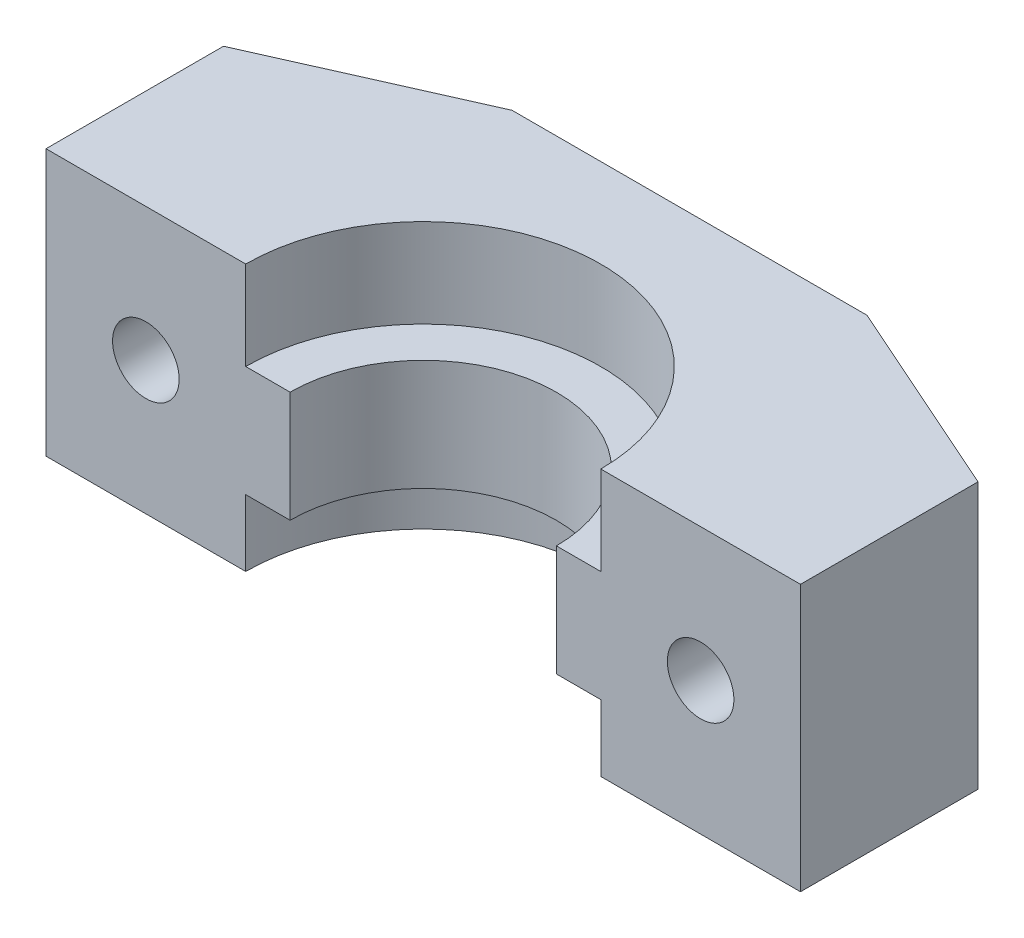
ISO-10303-21;
HEADER;
FILE_DESCRIPTION(('STEP AP214'),'2;1');
FILE_NAME('part.step','',(''),(''),'','','');
FILE_SCHEMA(('AUTOMOTIVE_DESIGN { 1 0 10303 214 1 1 1 1 }'));
ENDSEC;
DATA;
#1=APPLICATION_CONTEXT('core data for automotive mechanical design processes');
#2=APPLICATION_PROTOCOL_DEFINITION('international standard','automotive_design',2000,#1);
#3=PRODUCT_CONTEXT('',#1,'mechanical');
#4=PRODUCT('Part','Part','',(#3));
#5=PRODUCT_RELATED_PRODUCT_CATEGORY('part','',(#4));
#6=PRODUCT_DEFINITION_FORMATION('','',#4);
#7=PRODUCT_DEFINITION_CONTEXT('part definition',#1,'design');
#8=PRODUCT_DEFINITION('design','',#6,#7);
#9=PRODUCT_DEFINITION_SHAPE('','',#8);
#10=(LENGTH_UNIT() NAMED_UNIT(*) SI_UNIT(.MILLI.,.METRE.));
#11=(NAMED_UNIT(*) PLANE_ANGLE_UNIT() SI_UNIT($,.RADIAN.));
#12=(NAMED_UNIT(*) SI_UNIT($,.STERADIAN.) SOLID_ANGLE_UNIT());
#13=UNCERTAINTY_MEASURE_WITH_UNIT(LENGTH_MEASURE(1.E-05),#10,'distance_accuracy_value','');
#14=(GEOMETRIC_REPRESENTATION_CONTEXT(3) GLOBAL_UNCERTAINTY_ASSIGNED_CONTEXT((#13)) GLOBAL_UNIT_ASSIGNED_CONTEXT((#10,
#11,#12)) REPRESENTATION_CONTEXT('',''));
#15=CARTESIAN_POINT('',(0.,0.,0.));
#16=DIRECTION('',(0.,0.,1.));
#17=DIRECTION('',(1.,0.,0.));
#18=AXIS2_PLACEMENT_3D('',#15,#16,#17);
#19=CARTESIAN_POINT('',(0.,12.,0.));
#20=DIRECTION('',(0.,0.,-1.));
#21=DIRECTION('',(-1.,0.,0.));
#22=AXIS2_PLACEMENT_3D('',#19,#20,#21);
#23=PLANE('',#22);
#24=CARTESIAN_POINT('',(4.5,6.,0.));
#25=DIRECTION('',(0.,0.,1.));
#26=DIRECTION('',(1.,0.,0.));
#27=AXIS2_PLACEMENT_3D('',#24,#25,#26);
#28=CIRCLE('',#27,1.5);
#29=CARTESIAN_POINT('',(6.,6.,0.));
#30=VERTEX_POINT('',#29);
#31=EDGE_CURVE('E176',#30,#30,#28,.T.);
#32=ORIENTED_EDGE('',*,*,#31,.F.);
#33=EDGE_LOOP('',(#32));
#34=FACE_BOUND('',#33,.T.);
#35=DIRECTION('',(0.,1.,0.));
#36=VECTOR('',#35,1.);
#37=CARTESIAN_POINT('',(9.00000000000001,-57.5,0.));
#38=LINE('',#37,#36);
#39=CARTESIAN_POINT('',(9.00000000000001,0.,0.));
#40=VERTEX_POINT('',#39);
#41=CARTESIAN_POINT('',(9.00000000000001,3.,0.));
#42=VERTEX_POINT('',#41);
#43=EDGE_CURVE('E51',#40,#42,#38,.T.);
#44=ORIENTED_EDGE('',*,*,#43,.T.);
#45=DIRECTION('',(1.,0.,0.));
#46=VECTOR('',#45,1.);
#47=CARTESIAN_POINT('',(0.,3.,0.));
#48=LINE('',#47,#46);
#49=CARTESIAN_POINT('',(11.,3.,0.));
#50=VERTEX_POINT('',#49);
#51=EDGE_CURVE('E132',#42,#50,#48,.T.);
#52=ORIENTED_EDGE('',*,*,#51,.T.);
#53=DIRECTION('',(0.,-1.,0.));
#54=VECTOR('',#53,1.);
#55=CARTESIAN_POINT('',(11.,12.,0.));
#56=LINE('',#55,#54);
#57=CARTESIAN_POINT('',(11.,8.,0.));
#58=VERTEX_POINT('',#57);
#59=EDGE_CURVE('E11',#58,#50,#56,.T.);
#60=ORIENTED_EDGE('',*,*,#59,.F.);
#61=DIRECTION('',(1.,0.,0.));
#62=VECTOR('',#61,1.);
#63=CARTESIAN_POINT('',(0.,8.,0.));
#64=LINE('',#63,#62);
#65=CARTESIAN_POINT('',(9.00000000000001,7.99999999999999,0.));
#66=VERTEX_POINT('',#65);
#67=EDGE_CURVE('E161',#66,#58,#64,.T.);
#68=ORIENTED_EDGE('',*,*,#67,.F.);
#69=DIRECTION('',(0.,-1.,0.));
#70=VECTOR('',#69,1.);
#71=CARTESIAN_POINT('',(9.00000000000001,74.5,0.));
#72=LINE('',#71,#70);
#73=CARTESIAN_POINT('',(9.00000000000001,12.,0.));
#74=VERTEX_POINT('',#73);
#75=EDGE_CURVE('E157',#74,#66,#72,.T.);
#76=ORIENTED_EDGE('',*,*,#75,.F.);
#77=DIRECTION('',(1.,0.,0.));
#78=VECTOR('',#77,1.);
#79=CARTESIAN_POINT('',(0.,12.,0.));
#80=LINE('',#79,#78);
#81=CARTESIAN_POINT('',(0.,12.,0.));
#82=VERTEX_POINT('',#81);
#83=EDGE_CURVE('E181',#82,#74,#80,.T.);
#84=ORIENTED_EDGE('',*,*,#83,.F.);
#85=DIRECTION('',(0.,-1.,0.));
#86=VECTOR('',#85,1.);
#87=CARTESIAN_POINT('',(0.,12.,0.));
#88=LINE('',#87,#86);
#89=CARTESIAN_POINT('',(0.,0.,0.));
#90=VERTEX_POINT('',#89);
#91=EDGE_CURVE('E197',#82,#90,#88,.T.);
#92=ORIENTED_EDGE('',*,*,#91,.T.);
#93=DIRECTION('',(1.,0.,0.));
#94=VECTOR('',#93,1.);
#95=CARTESIAN_POINT('',(0.,0.,0.));
#96=LINE('',#95,#94);
#97=EDGE_CURVE('E180',#90,#40,#96,.T.);
#98=ORIENTED_EDGE('',*,*,#97,.T.);
#99=EDGE_LOOP('',(#44,#52,#60,#68,#76,#84,#92,#98));
#100=FACE_BOUND('',#99,.T.);
#101=ADVANCED_FACE('F35',(#34,#100),#23,.F.);
#102=CARTESIAN_POINT('',(17.,12.,0.));
#103=DIRECTION('',(0.,-1.,0.));
#104=DIRECTION('',(0.,0.,-1.));
#105=AXIS2_PLACEMENT_3D('',#102,#103,#104);
#106=CYLINDRICAL_SURFACE('',#105,6.);
#107=CARTESIAN_POINT('',(17.,3.,0.));
#108=DIRECTION('',(0.,-1.,0.));
#109=DIRECTION('',(0.,0.,-1.));
#110=AXIS2_PLACEMENT_3D('',#107,#108,#109);
#111=CIRCLE('',#110,6.);
#112=CARTESIAN_POINT('',(23.,3.,0.));
#113=VERTEX_POINT('',#112);
#114=EDGE_CURVE('E134',#50,#113,#111,.T.);
#115=ORIENTED_EDGE('',*,*,#114,.T.);
#116=DIRECTION('',(0.,-1.,0.));
#117=VECTOR('',#116,1.);
#118=CARTESIAN_POINT('',(23.,12.,0.));
#119=LINE('',#118,#117);
#120=CARTESIAN_POINT('',(23.,8.,0.));
#121=VERTEX_POINT('',#120);
#122=EDGE_CURVE('E43',#121,#113,#119,.T.);
#123=ORIENTED_EDGE('',*,*,#122,.F.);
#124=CARTESIAN_POINT('',(17.,8.,0.));
#125=DIRECTION('',(0.,-1.,0.));
#126=DIRECTION('',(0.,0.,-1.));
#127=AXIS2_PLACEMENT_3D('',#124,#125,#126);
#128=CIRCLE('',#127,6.);
#129=EDGE_CURVE('E163',#58,#121,#128,.T.);
#130=ORIENTED_EDGE('',*,*,#129,.F.);
#131=ORIENTED_EDGE('',*,*,#59,.T.);
#132=EDGE_LOOP('',(#115,#123,#130,#131));
#133=FACE_BOUND('',#132,.T.);
#134=ADVANCED_FACE('F258',(#133),#106,.F.);
#135=CARTESIAN_POINT('',(34.,12.,0.));
#136=DIRECTION('',(0.,0.,-1.));
#137=DIRECTION('',(-1.,0.,0.));
#138=AXIS2_PLACEMENT_3D('',#135,#136,#137);
#139=PLANE('',#138);
#140=CARTESIAN_POINT('',(29.5,6.,0.));
#141=DIRECTION('',(0.,0.,1.));
#142=DIRECTION('',(1.,0.,0.));
#143=AXIS2_PLACEMENT_3D('',#140,#141,#142);
#144=CIRCLE('',#143,1.5);
#145=CARTESIAN_POINT('',(31.,6.,0.));
#146=VERTEX_POINT('',#145);
#147=EDGE_CURVE('E173',#146,#146,#144,.T.);
#148=ORIENTED_EDGE('',*,*,#147,.F.);
#149=EDGE_LOOP('',(#148));
#150=FACE_BOUND('',#149,.T.);
#151=DIRECTION('',(0.,1.,0.));
#152=VECTOR('',#151,1.);
#153=CARTESIAN_POINT('',(25.,-57.5,0.));
#154=LINE('',#153,#152);
#155=CARTESIAN_POINT('',(25.,0.,0.));
#156=VERTEX_POINT('',#155);
#157=CARTESIAN_POINT('',(25.,3.,0.));
#158=VERTEX_POINT('',#157);
#159=EDGE_CURVE('E133',#156,#158,#154,.T.);
#160=ORIENTED_EDGE('',*,*,#159,.F.);
#161=DIRECTION('',(1.,0.,0.));
#162=VECTOR('',#161,1.);
#163=CARTESIAN_POINT('',(34.,0.,0.));
#164=LINE('',#163,#162);
#165=CARTESIAN_POINT('',(34.,0.,0.));
#166=VERTEX_POINT('',#165);
#167=EDGE_CURVE('E200',#156,#166,#164,.T.);
#168=ORIENTED_EDGE('',*,*,#167,.T.);
#169=DIRECTION('',(0.,-1.,0.));
#170=VECTOR('',#169,1.);
#171=CARTESIAN_POINT('',(34.,12.,0.));
#172=LINE('',#171,#170);
#173=CARTESIAN_POINT('',(34.,12.,0.));
#174=VERTEX_POINT('',#173);
#175=EDGE_CURVE('E225',#174,#166,#172,.T.);
#176=ORIENTED_EDGE('',*,*,#175,.F.);
#177=DIRECTION('',(1.,0.,0.));
#178=VECTOR('',#177,1.);
#179=CARTESIAN_POINT('',(34.,12.,0.));
#180=LINE('',#179,#178);
#181=CARTESIAN_POINT('',(25.,12.,0.));
#182=VERTEX_POINT('',#181);
#183=EDGE_CURVE('E184',#182,#174,#180,.T.);
#184=ORIENTED_EDGE('',*,*,#183,.F.);
#185=DIRECTION('',(0.,-1.,0.));
#186=VECTOR('',#185,1.);
#187=CARTESIAN_POINT('',(25.,74.5,0.));
#188=LINE('',#187,#186);
#189=CARTESIAN_POINT('',(25.,7.99999999999999,0.));
#190=VERTEX_POINT('',#189);
#191=EDGE_CURVE('E59',#182,#190,#188,.T.);
#192=ORIENTED_EDGE('',*,*,#191,.T.);
#193=DIRECTION('',(1.,0.,0.));
#194=VECTOR('',#193,1.);
#195=CARTESIAN_POINT('',(34.,8.,0.));
#196=LINE('',#195,#194);
#197=EDGE_CURVE('E155',#121,#190,#196,.T.);
#198=ORIENTED_EDGE('',*,*,#197,.F.);
#199=ORIENTED_EDGE('',*,*,#122,.T.);
#200=DIRECTION('',(1.,0.,0.));
#201=VECTOR('',#200,1.);
#202=CARTESIAN_POINT('',(34.,3.,0.));
#203=LINE('',#202,#201);
#204=EDGE_CURVE('E129',#113,#158,#203,.T.);
#205=ORIENTED_EDGE('',*,*,#204,.T.);
#206=EDGE_LOOP('',(#160,#168,#176,#184,#192,#198,#199,#205));
#207=FACE_BOUND('',#206,.T.);
#208=ADVANCED_FACE('F143',(#150,#207),#139,.F.);
#209=CARTESIAN_POINT('',(17.,0.,0.));
#210=DIRECTION('',(0.,-1.,0.));
#211=DIRECTION('',(0.,0.,-1.));
#212=AXIS2_PLACEMENT_3D('',#209,#210,#211);
#213=PLANE('',#212);
#214=ORIENTED_EDGE('',*,*,#167,.F.);
#215=CARTESIAN_POINT('',(17.,0.,0.));
#216=DIRECTION('',(0.,-1.,0.));
#217=DIRECTION('',(0.,0.,-1.));
#218=AXIS2_PLACEMENT_3D('',#215,#216,#217);
#219=CIRCLE('',#218,8.);
#220=EDGE_CURVE('E138',#40,#156,#219,.T.);
#221=ORIENTED_EDGE('',*,*,#220,.F.);
#222=ORIENTED_EDGE('',*,*,#97,.F.);
#223=DIRECTION('',(0.,0.,1.));
#224=VECTOR('',#223,1.);
#225=CARTESIAN_POINT('',(0.,0.,0.));
#226=LINE('',#225,#224);
#227=CARTESIAN_POINT('',(0.,0.,-8.));
#228=VERTEX_POINT('',#227);
#229=EDGE_CURVE('E185',#228,#90,#226,.T.);
#230=ORIENTED_EDGE('',*,*,#229,.F.);
#231=DIRECTION('',(-0.913811548620257,0.,0.406138466053448));
#232=VECTOR('',#231,1.);
#233=CARTESIAN_POINT('',(9.,0.,-12.));
#234=LINE('',#233,#232);
#235=CARTESIAN_POINT('',(9.,0.,-12.));
#236=VERTEX_POINT('',#235);
#237=EDGE_CURVE('E208',#236,#228,#234,.T.);
#238=ORIENTED_EDGE('',*,*,#237,.F.);
#239=DIRECTION('',(-1.,0.,0.));
#240=VECTOR('',#239,1.);
#241=CARTESIAN_POINT('',(9.,0.,-12.));
#242=LINE('',#241,#240);
#243=CARTESIAN_POINT('',(25.,0.,-12.));
#244=VERTEX_POINT('',#243);
#245=EDGE_CURVE('E206',#244,#236,#242,.T.);
#246=ORIENTED_EDGE('',*,*,#245,.F.);
#247=DIRECTION('',(-0.913811548620257,0.,-0.406138466053447));
#248=VECTOR('',#247,1.);
#249=CARTESIAN_POINT('',(25.,0.,-12.));
#250=LINE('',#249,#248);
#251=CARTESIAN_POINT('',(34.,0.,-8.));
#252=VERTEX_POINT('',#251);
#253=EDGE_CURVE('E204',#252,#244,#250,.T.);
#254=ORIENTED_EDGE('',*,*,#253,.F.);
#255=DIRECTION('',(0.,0.,-1.));
#256=VECTOR('',#255,1.);
#257=CARTESIAN_POINT('',(34.,0.,0.));
#258=LINE('',#257,#256);
#259=EDGE_CURVE('E202',#166,#252,#258,.T.);
#260=ORIENTED_EDGE('',*,*,#259,.F.);
#261=EDGE_LOOP('',(#214,#221,#222,#230,#238,#246,#254,#260));
#262=FACE_BOUND('',#261,.T.);
#263=ADVANCED_FACE('F273',(#262),#213,.T.);
#264=CARTESIAN_POINT('',(34.,12.,0.));
#265=DIRECTION('',(-1.,0.,0.));
#266=DIRECTION('',(0.,0.,1.));
#267=AXIS2_PLACEMENT_3D('',#264,#265,#266);
#268=PLANE('',#267);
#269=ORIENTED_EDGE('',*,*,#259,.T.);
#270=DIRECTION('',(0.,-1.,0.));
#271=VECTOR('',#270,1.);
#272=CARTESIAN_POINT('',(34.,12.,-8.));
#273=LINE('',#272,#271);
#274=CARTESIAN_POINT('',(34.,12.,-8.));
#275=VERTEX_POINT('',#274);
#276=EDGE_CURVE('E222',#275,#252,#273,.T.);
#277=ORIENTED_EDGE('',*,*,#276,.F.);
#278=DIRECTION('',(0.,0.,-1.));
#279=VECTOR('',#278,1.);
#280=CARTESIAN_POINT('',(34.,12.,0.));
#281=LINE('',#280,#279);
#282=EDGE_CURVE('E187',#174,#275,#281,.T.);
#283=ORIENTED_EDGE('',*,*,#282,.F.);
#284=ORIENTED_EDGE('',*,*,#175,.T.);
#285=EDGE_LOOP('',(#269,#277,#283,#284));
#286=FACE_BOUND('',#285,.T.);
#287=ADVANCED_FACE('F281',(#286),#268,.F.);
#288=CARTESIAN_POINT('',(25.,12.,-12.));
#289=DIRECTION('',(-0.406138466053447,0.,0.913811548620257));
#290=DIRECTION('',(0.913811548620257,0.,0.406138466053448));
#291=AXIS2_PLACEMENT_3D('',#288,#289,#290);
#292=PLANE('',#291);
#293=CARTESIAN_POINT('',(29.5,6.,-10.));
#294=DIRECTION('',(-0.406138466053447,0.,0.913811548620257));
#295=DIRECTION('',(0.913811548620257,0.,0.406138466053448));
#296=AXIS2_PLACEMENT_3D('',#293,#294,#295);
#297=ELLIPSE('',#296,3.83011136736515,3.5);
#298=CARTESIAN_POINT('',(33.,6.,-8.44444444444445));
#299=VERTEX_POINT('',#298);
#300=EDGE_CURVE('E38',#299,#299,#297,.T.);
#301=ORIENTED_EDGE('',*,*,#300,.T.);
#302=EDGE_LOOP('',(#301));
#303=FACE_BOUND('',#302,.T.);
#304=ORIENTED_EDGE('',*,*,#253,.T.);
#305=DIRECTION('',(0.,-1.,0.));
#306=VECTOR('',#305,1.);
#307=CARTESIAN_POINT('',(25.,12.,-12.));
#308=LINE('',#307,#306);
#309=CARTESIAN_POINT('',(25.,12.,-12.));
#310=VERTEX_POINT('',#309);
#311=EDGE_CURVE('E219',#310,#244,#308,.T.);
#312=ORIENTED_EDGE('',*,*,#311,.F.);
#313=DIRECTION('',(-0.913811548620257,0.,-0.406138466053447));
#314=VECTOR('',#313,1.);
#315=CARTESIAN_POINT('',(25.,12.,-12.));
#316=LINE('',#315,#314);
#317=EDGE_CURVE('E189',#275,#310,#316,.T.);
#318=ORIENTED_EDGE('',*,*,#317,.F.);
#319=ORIENTED_EDGE('',*,*,#276,.T.);
#320=EDGE_LOOP('',(#304,#312,#318,#319));
#321=FACE_BOUND('',#320,.T.);
#322=ADVANCED_FACE('F238',(#303,#321),#292,.F.);
#323=CARTESIAN_POINT('',(9.,12.,-12.));
#324=DIRECTION('',(0.,0.,1.));
#325=DIRECTION('',(1.,0.,0.));
#326=AXIS2_PLACEMENT_3D('',#323,#324,#325);
#327=PLANE('',#326);
#328=ORIENTED_EDGE('',*,*,#245,.T.);
#329=DIRECTION('',(0.,-1.,0.));
#330=VECTOR('',#329,1.);
#331=CARTESIAN_POINT('',(9.,12.,-12.));
#332=LINE('',#331,#330);
#333=CARTESIAN_POINT('',(9.,12.,-12.));
#334=VERTEX_POINT('',#333);
#335=EDGE_CURVE('E216',#334,#236,#332,.T.);
#336=ORIENTED_EDGE('',*,*,#335,.F.);
#337=DIRECTION('',(-1.,0.,0.));
#338=VECTOR('',#337,1.);
#339=CARTESIAN_POINT('',(9.,12.,-12.));
#340=LINE('',#339,#338);
#341=EDGE_CURVE('E191',#310,#334,#340,.T.);
#342=ORIENTED_EDGE('',*,*,#341,.F.);
#343=ORIENTED_EDGE('',*,*,#311,.T.);
#344=EDGE_LOOP('',(#328,#336,#342,#343));
#345=FACE_BOUND('',#344,.T.);
#346=ADVANCED_FACE('F412',(#345),#327,.F.);
#347=CARTESIAN_POINT('',(9.,12.,-12.));
#348=DIRECTION('',(0.406138466053448,0.,0.913811548620257));
#349=DIRECTION('',(0.913811548620257,0.,-0.406138466053448));
#350=AXIS2_PLACEMENT_3D('',#347,#348,#349);
#351=PLANE('',#350);
#352=CARTESIAN_POINT('',(4.5,6.,-10.));
#353=DIRECTION('',(0.406138466053448,0.,0.913811548620257));
#354=DIRECTION('',(-0.913811548620257,0.,0.406138466053448));
#355=AXIS2_PLACEMENT_3D('',#352,#353,#354);
#356=ELLIPSE('',#355,3.83011136736515,3.5);
#357=CARTESIAN_POINT('',(1.,6.,-8.44444444444444));
#358=VERTEX_POINT('',#357);
#359=EDGE_CURVE('E177',#358,#358,#356,.T.);
#360=ORIENTED_EDGE('',*,*,#359,.T.);
#361=EDGE_LOOP('',(#360));
#362=FACE_BOUND('',#361,.T.);
#363=ORIENTED_EDGE('',*,*,#237,.T.);
#364=DIRECTION('',(0.,-1.,0.));
#365=VECTOR('',#364,1.);
#366=CARTESIAN_POINT('',(0.,12.,-8.));
#367=LINE('',#366,#365);
#368=CARTESIAN_POINT('',(0.,12.,-8.));
#369=VERTEX_POINT('',#368);
#370=EDGE_CURVE('E213',#369,#228,#367,.T.);
#371=ORIENTED_EDGE('',*,*,#370,.F.);
#372=DIRECTION('',(-0.913811548620257,0.,0.406138466053448));
#373=VECTOR('',#372,1.);
#374=CARTESIAN_POINT('',(9.,12.,-12.));
#375=LINE('',#374,#373);
#376=EDGE_CURVE('E193',#334,#369,#375,.T.);
#377=ORIENTED_EDGE('',*,*,#376,.F.);
#378=ORIENTED_EDGE('',*,*,#335,.T.);
#379=EDGE_LOOP('',(#363,#371,#377,#378));
#380=FACE_BOUND('',#379,.T.);
#381=ADVANCED_FACE('F403',(#362,#380),#351,.F.);
#382=CARTESIAN_POINT('',(0.,12.,0.));
#383=DIRECTION('',(1.,0.,0.));
#384=DIRECTION('',(0.,0.,-1.));
#385=AXIS2_PLACEMENT_3D('',#382,#383,#384);
#386=PLANE('',#385);
#387=ORIENTED_EDGE('',*,*,#229,.T.);
#388=ORIENTED_EDGE('',*,*,#91,.F.);
#389=DIRECTION('',(0.,0.,1.));
#390=VECTOR('',#389,1.);
#391=CARTESIAN_POINT('',(0.,12.,0.));
#392=LINE('',#391,#390);
#393=EDGE_CURVE('E195',#369,#82,#392,.T.);
#394=ORIENTED_EDGE('',*,*,#393,.F.);
#395=ORIENTED_EDGE('',*,*,#370,.T.);
#396=EDGE_LOOP('',(#387,#388,#394,#395));
#397=FACE_BOUND('',#396,.T.);
#398=ADVANCED_FACE('F395',(#397),#386,.F.);
#399=CARTESIAN_POINT('',(17.,12.,0.));
#400=DIRECTION('',(0.,-1.,0.));
#401=DIRECTION('',(0.,0.,-1.));
#402=AXIS2_PLACEMENT_3D('',#399,#400,#401);
#403=PLANE('',#402);
#404=ORIENTED_EDGE('',*,*,#83,.T.);
#405=CARTESIAN_POINT('',(17.,12.,0.));
#406=DIRECTION('',(0.,-1.,0.));
#407=DIRECTION('',(0.,0.,-1.));
#408=AXIS2_PLACEMENT_3D('',#405,#406,#407);
#409=CIRCLE('',#408,8.);
#410=EDGE_CURVE('E153',#182,#74,#409,.F.);
#411=ORIENTED_EDGE('',*,*,#410,.F.);
#412=ORIENTED_EDGE('',*,*,#183,.T.);
#413=ORIENTED_EDGE('',*,*,#282,.T.);
#414=ORIENTED_EDGE('',*,*,#317,.T.);
#415=ORIENTED_EDGE('',*,*,#341,.T.);
#416=ORIENTED_EDGE('',*,*,#376,.T.);
#417=ORIENTED_EDGE('',*,*,#393,.T.);
#418=EDGE_LOOP('',(#404,#411,#412,#413,#414,#415,#416,#417));
#419=FACE_BOUND('',#418,.T.);
#420=ADVANCED_FACE('F285',(#419),#403,.F.);
#421=CARTESIAN_POINT('',(4.5,6.,-12.));
#422=DIRECTION('',(0.,0.,1.));
#423=DIRECTION('',(1.,0.,0.));
#424=AXIS2_PLACEMENT_3D('',#421,#422,#423);
#425=CYLINDRICAL_SURFACE('',#424,1.5);
#426=CARTESIAN_POINT('',(4.5,6.,-6.));
#427=DIRECTION('',(0.,0.,1.));
#428=DIRECTION('',(1.,0.,0.));
#429=AXIS2_PLACEMENT_3D('',#426,#427,#428);
#430=CIRCLE('',#429,1.5);
#431=CARTESIAN_POINT('',(6.,6.,-6.));
#432=VERTEX_POINT('',#431);
#433=EDGE_CURVE('E172',#432,#432,#430,.F.);
#434=CARTESIAN_POINT('',(6.,6.,-6.));
#435=CARTESIAN_POINT('',(6.,6.,-5.9375));
#436=CARTESIAN_POINT('',(6.,6.,-5.875));
#437=CARTESIAN_POINT('',(6.,6.,-5.75));
#438=CARTESIAN_POINT('',(6.,6.,-5.6875));
#439=CARTESIAN_POINT('',(6.,6.,-5.5625));
#440=CARTESIAN_POINT('',(6.,6.,-5.5));
#441=CARTESIAN_POINT('',(6.,6.,-5.375));
#442=CARTESIAN_POINT('',(6.,6.,-5.3125));
#443=CARTESIAN_POINT('',(6.,6.,-5.1875));
#444=CARTESIAN_POINT('',(6.,6.,-5.125));
#445=CARTESIAN_POINT('',(6.,6.,-5.));
#446=CARTESIAN_POINT('',(6.,6.,-4.9375));
#447=CARTESIAN_POINT('',(6.,6.,-4.8125));
#448=CARTESIAN_POINT('',(6.,6.,-4.75));
#449=CARTESIAN_POINT('',(6.,6.,-4.625));
#450=CARTESIAN_POINT('',(6.,6.,-4.5625));
#451=CARTESIAN_POINT('',(6.,6.,-4.4375));
#452=CARTESIAN_POINT('',(6.,6.,-4.375));
#453=CARTESIAN_POINT('',(6.,6.,-4.25));
#454=CARTESIAN_POINT('',(6.,6.,-4.1875));
#455=CARTESIAN_POINT('',(6.,6.,-4.0625));
#456=CARTESIAN_POINT('',(6.,6.,-4.));
#457=CARTESIAN_POINT('',(6.,6.,-3.875));
#458=CARTESIAN_POINT('',(6.,6.,-3.8125));
#459=CARTESIAN_POINT('',(6.,6.,-3.6875));
#460=CARTESIAN_POINT('',(6.,6.,-3.625));
#461=CARTESIAN_POINT('',(6.,6.,-3.5));
#462=CARTESIAN_POINT('',(6.,6.,-3.4375));
#463=CARTESIAN_POINT('',(6.,6.,-3.3125));
#464=CARTESIAN_POINT('',(6.,6.,-3.25));
#465=CARTESIAN_POINT('',(6.,6.,-3.125));
#466=CARTESIAN_POINT('',(6.,6.,-3.0625));
#467=CARTESIAN_POINT('',(6.,6.,-2.9375));
#468=CARTESIAN_POINT('',(6.,6.,-2.875));
#469=CARTESIAN_POINT('',(6.,6.,-2.75));
#470=CARTESIAN_POINT('',(6.,6.,-2.6875));
#471=CARTESIAN_POINT('',(6.,6.,-2.5625));
#472=CARTESIAN_POINT('',(6.,6.,-2.5));
#473=CARTESIAN_POINT('',(6.,6.,-2.375));
#474=CARTESIAN_POINT('',(6.,6.,-2.3125));
#475=CARTESIAN_POINT('',(6.,6.,-2.1875));
#476=CARTESIAN_POINT('',(6.,6.,-2.125));
#477=CARTESIAN_POINT('',(6.,6.,-2.));
#478=CARTESIAN_POINT('',(6.,6.,-1.9375));
#479=CARTESIAN_POINT('',(6.,6.,-1.8125));
#480=CARTESIAN_POINT('',(6.,6.,-1.75));
#481=CARTESIAN_POINT('',(6.,6.,-1.625));
#482=CARTESIAN_POINT('',(6.,6.,-1.5625));
#483=CARTESIAN_POINT('',(6.,6.,-1.4375));
#484=CARTESIAN_POINT('',(6.,6.,-1.375));
#485=CARTESIAN_POINT('',(6.,6.,-1.25));
#486=CARTESIAN_POINT('',(6.,6.,-1.1875));
#487=CARTESIAN_POINT('',(6.,6.,-1.0625));
#488=CARTESIAN_POINT('',(6.,6.,-1.));
#489=CARTESIAN_POINT('',(6.,6.,-0.875000000000001));
#490=CARTESIAN_POINT('',(6.,6.,-0.812500000000001));
#491=CARTESIAN_POINT('',(6.,6.,-0.687500000000001));
#492=CARTESIAN_POINT('',(6.,6.,-0.625000000000001));
#493=CARTESIAN_POINT('',(6.,6.,-0.5));
#494=CARTESIAN_POINT('',(6.,6.,-0.4375));
#495=CARTESIAN_POINT('',(6.,6.,-0.3125));
#496=CARTESIAN_POINT('',(6.,6.,-0.25));
#497=CARTESIAN_POINT('',(6.,6.,-0.125));
#498=CARTESIAN_POINT('',(6.,6.,-0.0625000000000001));
#499=CARTESIAN_POINT('',(6.,6.,0.));
#500=B_SPLINE_CURVE_WITH_KNOTS('',3,(#434,#435,#436,#437,#438,#439,#440,#441,#442,#443,#444,
#445,#446,#447,#448,#449,#450,#451,#452,#453,#454,#455,#456,#457,#458,#459,#460,#461,#462,#463,
#464,#465,#466,#467,#468,#469,#470,#471,#472,#473,#474,#475,#476,#477,#478,#479,#480,#481,#482,
#483,#484,#485,#486,#487,#488,#489,#490,#491,#492,#493,#494,#495,#496,#497,#498,#499),
.UNSPECIFIED.,.F.,.F.,(4,2,2,2,2,2,2,2,2,2,2,2,2,2,2,2,2,2,2,2,2,2,2,2,2,2,2,2,2,2,2,2,4),(0.,
0.1875,0.375,0.5625,0.750000000000001,0.9375,1.125,1.3125,1.5,1.6875,1.875,2.0625,2.25,2.4375,
2.625,2.8125,3.,3.1875,3.375,3.5625,3.75,3.9375,4.125,4.3125,4.5,4.6875,4.875,5.0625,5.25,
5.4375,5.625,5.8125,6.),.UNSPECIFIED.);
#501=EDGE_CURVE('BSEAM380',#432,#30,#500,.T.);
#502=ORIENTED_EDGE('',*,*,#433,.T.);
#503=ORIENTED_EDGE('',*,*,#31,.T.);
#504=ORIENTED_EDGE('',*,*,#501,.T.);
#505=ORIENTED_EDGE('',*,*,#501,.F.);
#506=EDGE_LOOP('',(#502,#504,#503,#505));
#507=FACE_BOUND('',#506,.T.);
#508=ADVANCED_FACE('F380',(#507),#425,.F.);
#509=CARTESIAN_POINT('',(29.5,6.,-12.));
#510=DIRECTION('',(0.,0.,1.));
#511=DIRECTION('',(1.,0.,0.));
#512=AXIS2_PLACEMENT_3D('',#509,#510,#511);
#513=CYLINDRICAL_SURFACE('',#512,1.5);
#514=CARTESIAN_POINT('',(29.5,6.,-6.));
#515=DIRECTION('',(0.,0.,1.));
#516=DIRECTION('',(1.,0.,0.));
#517=AXIS2_PLACEMENT_3D('',#514,#515,#516);
#518=CIRCLE('',#517,1.5);
#519=CARTESIAN_POINT('',(31.,6.,-6.));
#520=VERTEX_POINT('',#519);
#521=EDGE_CURVE('E168',#520,#520,#518,.F.);
#522=CARTESIAN_POINT('',(31.,6.,-6.));
#523=CARTESIAN_POINT('',(31.,6.,-5.9375));
#524=CARTESIAN_POINT('',(31.,6.,-5.875));
#525=CARTESIAN_POINT('',(31.,6.,-5.75));
#526=CARTESIAN_POINT('',(31.,6.,-5.6875));
#527=CARTESIAN_POINT('',(31.,6.,-5.5625));
#528=CARTESIAN_POINT('',(31.,6.,-5.5));
#529=CARTESIAN_POINT('',(31.,6.,-5.375));
#530=CARTESIAN_POINT('',(31.,6.,-5.3125));
#531=CARTESIAN_POINT('',(31.,6.,-5.1875));
#532=CARTESIAN_POINT('',(31.,6.,-5.125));
#533=CARTESIAN_POINT('',(31.,6.,-5.));
#534=CARTESIAN_POINT('',(31.,6.,-4.9375));
#535=CARTESIAN_POINT('',(31.,6.,-4.8125));
#536=CARTESIAN_POINT('',(31.,6.,-4.75));
#537=CARTESIAN_POINT('',(31.,6.,-4.625));
#538=CARTESIAN_POINT('',(31.,6.,-4.5625));
#539=CARTESIAN_POINT('',(31.,6.,-4.4375));
#540=CARTESIAN_POINT('',(31.,6.,-4.375));
#541=CARTESIAN_POINT('',(31.,6.,-4.25));
#542=CARTESIAN_POINT('',(31.,6.,-4.1875));
#543=CARTESIAN_POINT('',(31.,6.,-4.0625));
#544=CARTESIAN_POINT('',(31.,6.,-4.));
#545=CARTESIAN_POINT('',(31.,6.,-3.875));
#546=CARTESIAN_POINT('',(31.,6.,-3.8125));
#547=CARTESIAN_POINT('',(31.,6.,-3.6875));
#548=CARTESIAN_POINT('',(31.,6.,-3.625));
#549=CARTESIAN_POINT('',(31.,6.,-3.5));
#550=CARTESIAN_POINT('',(31.,6.,-3.4375));
#551=CARTESIAN_POINT('',(31.,6.,-3.3125));
#552=CARTESIAN_POINT('',(31.,6.,-3.25));
#553=CARTESIAN_POINT('',(31.,6.,-3.125));
#554=CARTESIAN_POINT('',(31.,6.,-3.0625));
#555=CARTESIAN_POINT('',(31.,6.,-2.9375));
#556=CARTESIAN_POINT('',(31.,6.,-2.875));
#557=CARTESIAN_POINT('',(31.,6.,-2.75));
#558=CARTESIAN_POINT('',(31.,6.,-2.6875));
#559=CARTESIAN_POINT('',(31.,6.,-2.5625));
#560=CARTESIAN_POINT('',(31.,6.,-2.5));
#561=CARTESIAN_POINT('',(31.,6.,-2.375));
#562=CARTESIAN_POINT('',(31.,6.,-2.3125));
#563=CARTESIAN_POINT('',(31.,6.,-2.1875));
#564=CARTESIAN_POINT('',(31.,6.,-2.125));
#565=CARTESIAN_POINT('',(31.,6.,-2.));
#566=CARTESIAN_POINT('',(31.,6.,-1.9375));
#567=CARTESIAN_POINT('',(31.,6.,-1.8125));
#568=CARTESIAN_POINT('',(31.,6.,-1.75));
#569=CARTESIAN_POINT('',(31.,6.,-1.625));
#570=CARTESIAN_POINT('',(31.,6.,-1.5625));
#571=CARTESIAN_POINT('',(31.,6.,-1.4375));
#572=CARTESIAN_POINT('',(31.,6.,-1.375));
#573=CARTESIAN_POINT('',(31.,6.,-1.25));
#574=CARTESIAN_POINT('',(31.,6.,-1.1875));
#575=CARTESIAN_POINT('',(31.,6.,-1.0625));
#576=CARTESIAN_POINT('',(31.,6.,-1.));
#577=CARTESIAN_POINT('',(31.,6.,-0.875000000000001));
#578=CARTESIAN_POINT('',(31.,6.,-0.812500000000001));
#579=CARTESIAN_POINT('',(31.,6.,-0.687500000000001));
#580=CARTESIAN_POINT('',(31.,6.,-0.625000000000001));
#581=CARTESIAN_POINT('',(31.,6.,-0.5));
#582=CARTESIAN_POINT('',(31.,6.,-0.4375));
#583=CARTESIAN_POINT('',(31.,6.,-0.3125));
#584=CARTESIAN_POINT('',(31.,6.,-0.25));
#585=CARTESIAN_POINT('',(31.,6.,-0.125));
#586=CARTESIAN_POINT('',(31.,6.,-0.0625000000000001));
#587=CARTESIAN_POINT('',(31.,6.,0.));
#588=B_SPLINE_CURVE_WITH_KNOTS('',3,(#522,#523,#524,#525,#526,#527,#528,#529,#530,#531,#532,
#533,#534,#535,#536,#537,#538,#539,#540,#541,#542,#543,#544,#545,#546,#547,#548,#549,#550,#551,
#552,#553,#554,#555,#556,#557,#558,#559,#560,#561,#562,#563,#564,#565,#566,#567,#568,#569,#570,
#571,#572,#573,#574,#575,#576,#577,#578,#579,#580,#581,#582,#583,#584,#585,#586,#587),
.UNSPECIFIED.,.F.,.F.,(4,2,2,2,2,2,2,2,2,2,2,2,2,2,2,2,2,2,2,2,2,2,2,2,2,2,2,2,2,2,2,2,4),(0.,
0.1875,0.375,0.5625,0.750000000000001,0.9375,1.125,1.3125,1.5,1.6875,1.875,2.0625,2.25,2.4375,
2.625,2.8125,3.,3.1875,3.375,3.5625,3.75,3.9375,4.125,4.3125,4.5,4.6875,4.875,5.0625,5.25,
5.4375,5.625,5.8125,6.),.UNSPECIFIED.);
#589=EDGE_CURVE('BSEAM371',#520,#146,#588,.T.);
#590=ORIENTED_EDGE('',*,*,#521,.T.);
#591=ORIENTED_EDGE('',*,*,#147,.T.);
#592=ORIENTED_EDGE('',*,*,#589,.T.);
#593=ORIENTED_EDGE('',*,*,#589,.F.);
#594=EDGE_LOOP('',(#590,#592,#591,#593));
#595=FACE_BOUND('',#594,.T.);
#596=ADVANCED_FACE('F371',(#595),#513,.F.);
#597=CARTESIAN_POINT('',(4.5,6.,-12.));
#598=DIRECTION('',(0.,0.,1.));
#599=DIRECTION('',(1.,0.,0.));
#600=AXIS2_PLACEMENT_3D('',#597,#598,#599);
#601=CYLINDRICAL_SURFACE('',#600,3.5);
#602=CARTESIAN_POINT('',(4.5,6.,-6.));
#603=DIRECTION('',(0.,0.,1.));
#604=DIRECTION('',(1.,0.,0.));
#605=AXIS2_PLACEMENT_3D('',#602,#603,#604);
#606=CIRCLE('',#605,3.5);
#607=CARTESIAN_POINT('',(8.,6.,-6.));
#608=VERTEX_POINT('',#607);
#609=EDGE_CURVE('E169',#608,#608,#606,.T.);
#610=ORIENTED_EDGE('',*,*,#609,.T.);
#611=EDGE_LOOP('',(#610));
#612=FACE_BOUND('',#611,.T.);
#613=ORIENTED_EDGE('',*,*,#359,.F.);
#614=EDGE_LOOP('',(#613));
#615=FACE_BOUND('',#614,.T.);
#616=ADVANCED_FACE('F254',(#612,#615),#601,.F.);
#617=CARTESIAN_POINT('',(4.5,6.,-6.));
#618=DIRECTION('',(0.,0.,1.));
#619=DIRECTION('',(1.,0.,0.));
#620=AXIS2_PLACEMENT_3D('',#617,#618,#619);
#621=PLANE('',#620);
#622=ORIENTED_EDGE('',*,*,#609,.F.);
#623=EDGE_LOOP('',(#622));
#624=FACE_BOUND('',#623,.T.);
#625=ORIENTED_EDGE('',*,*,#433,.F.);
#626=EDGE_LOOP('',(#625));
#627=FACE_BOUND('',#626,.T.);
#628=ADVANCED_FACE('F244',(#624,#627),#621,.F.);
#629=CARTESIAN_POINT('',(29.5,6.,-12.));
#630=DIRECTION('',(0.,0.,1.));
#631=DIRECTION('',(1.,0.,0.));
#632=AXIS2_PLACEMENT_3D('',#629,#630,#631);
#633=CYLINDRICAL_SURFACE('',#632,3.5);
#634=CARTESIAN_POINT('',(29.5,6.,-6.));
#635=DIRECTION('',(0.,0.,1.));
#636=DIRECTION('',(1.,0.,0.));
#637=AXIS2_PLACEMENT_3D('',#634,#635,#636);
#638=CIRCLE('',#637,3.5);
#639=CARTESIAN_POINT('',(33.,6.,-6.));
#640=VERTEX_POINT('',#639);
#641=EDGE_CURVE('E160',#640,#640,#638,.T.);
#642=ORIENTED_EDGE('',*,*,#641,.T.);
#643=EDGE_LOOP('',(#642));
#644=FACE_BOUND('',#643,.T.);
#645=ORIENTED_EDGE('',*,*,#300,.F.);
#646=EDGE_LOOP('',(#645));
#647=FACE_BOUND('',#646,.T.);
#648=ADVANCED_FACE('F241',(#644,#647),#633,.F.);
#649=CARTESIAN_POINT('',(29.5,6.,-6.));
#650=DIRECTION('',(0.,0.,1.));
#651=DIRECTION('',(1.,0.,0.));
#652=AXIS2_PLACEMENT_3D('',#649,#650,#651);
#653=PLANE('',#652);
#654=ORIENTED_EDGE('',*,*,#641,.F.);
#655=EDGE_LOOP('',(#654));
#656=FACE_BOUND('',#655,.T.);
#657=ORIENTED_EDGE('',*,*,#521,.F.);
#658=EDGE_LOOP('',(#657));
#659=FACE_BOUND('',#658,.T.);
#660=ADVANCED_FACE('F243',(#656,#659),#653,.F.);
#661=CARTESIAN_POINT('',(17.,74.5,0.));
#662=DIRECTION('',(0.,-1.,0.));
#663=DIRECTION('',(0.,0.,-1.));
#664=AXIS2_PLACEMENT_3D('',#661,#662,#663);
#665=CYLINDRICAL_SURFACE('',#664,8.);
#666=ORIENTED_EDGE('',*,*,#410,.T.);
#667=ORIENTED_EDGE('',*,*,#75,.T.);
#668=CARTESIAN_POINT('',(17.,7.99999999999999,0.));
#669=DIRECTION('',(0.,-1.,0.));
#670=DIRECTION('',(0.,0.,-1.));
#671=AXIS2_PLACEMENT_3D('',#668,#669,#670);
#672=CIRCLE('',#671,8.);
#673=EDGE_CURVE('E151',#190,#66,#672,.F.);
#674=ORIENTED_EDGE('',*,*,#673,.F.);
#675=ORIENTED_EDGE('',*,*,#191,.F.);
#676=EDGE_LOOP('',(#666,#667,#674,#675));
#677=FACE_BOUND('',#676,.T.);
#678=ADVANCED_FACE('F251',(#677),#665,.F.);
#679=CARTESIAN_POINT('',(17.,8.,0.));
#680=DIRECTION('',(0.,-1.,0.));
#681=DIRECTION('',(0.,0.,-1.));
#682=AXIS2_PLACEMENT_3D('',#679,#680,#681);
#683=PLANE('',#682);
#684=ORIENTED_EDGE('',*,*,#673,.T.);
#685=ORIENTED_EDGE('',*,*,#67,.T.);
#686=ORIENTED_EDGE('',*,*,#129,.T.);
#687=ORIENTED_EDGE('',*,*,#197,.T.);
#688=EDGE_LOOP('',(#684,#685,#686,#687));
#689=FACE_BOUND('',#688,.T.);
#690=ADVANCED_FACE('F291',(#689),#683,.F.);
#691=CARTESIAN_POINT('',(17.,-57.5,0.));
#692=DIRECTION('',(0.,1.,0.));
#693=DIRECTION('',(0.,0.,1.));
#694=AXIS2_PLACEMENT_3D('',#691,#692,#693);
#695=CYLINDRICAL_SURFACE('',#694,8.);
#696=ORIENTED_EDGE('',*,*,#43,.F.);
#697=ORIENTED_EDGE('',*,*,#220,.T.);
#698=ORIENTED_EDGE('',*,*,#159,.T.);
#699=CARTESIAN_POINT('',(17.,3.,0.));
#700=DIRECTION('',(0.,-1.,0.));
#701=DIRECTION('',(0.,0.,-1.));
#702=AXIS2_PLACEMENT_3D('',#699,#700,#701);
#703=CIRCLE('',#702,8.);
#704=EDGE_CURVE('E125',#42,#158,#703,.T.);
#705=ORIENTED_EDGE('',*,*,#704,.F.);
#706=EDGE_LOOP('',(#696,#697,#698,#705));
#707=FACE_BOUND('',#706,.T.);
#708=ADVANCED_FACE('F137',(#707),#695,.F.);
#709=CARTESIAN_POINT('',(17.,3.,0.));
#710=DIRECTION('',(0.,-1.,0.));
#711=DIRECTION('',(0.,0.,-1.));
#712=AXIS2_PLACEMENT_3D('',#709,#710,#711);
#713=PLANE('',#712);
#714=ORIENTED_EDGE('',*,*,#704,.T.);
#715=ORIENTED_EDGE('',*,*,#204,.F.);
#716=ORIENTED_EDGE('',*,*,#114,.F.);
#717=ORIENTED_EDGE('',*,*,#51,.F.);
#718=EDGE_LOOP('',(#714,#715,#716,#717));
#719=FACE_BOUND('',#718,.T.);
#720=ADVANCED_FACE('F127',(#719),#713,.T.);
#721=CLOSED_SHELL('',(#101,#134,#208,#263,#287,#322,#346,#381,#398,#420,#508,#596,#616,#628,
#648,#660,#678,#690,#708,#720));
#722=MANIFOLD_SOLID_BREP('B2',#721);
#723=ADVANCED_BREP_SHAPE_REPRESENTATION('',(#18,#722),#14);
#724=SHAPE_DEFINITION_REPRESENTATION(#9,#723);
ENDSEC;
END-ISO-10303-21;
